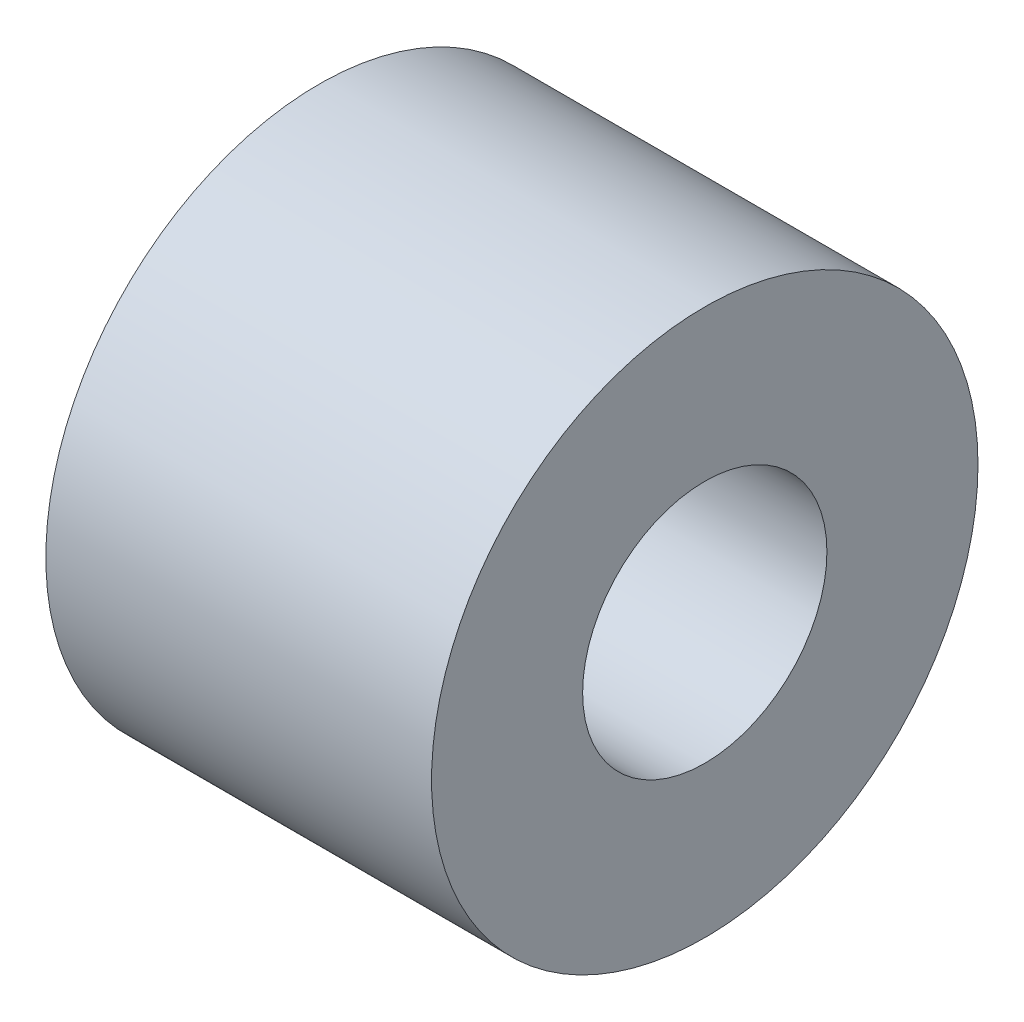
ISO-10303-21;
HEADER;
FILE_DESCRIPTION(('STEP AP214'),'2;1');
FILE_NAME('part.step','',(''),(''),'','','');
FILE_SCHEMA(('AUTOMOTIVE_DESIGN { 1 0 10303 214 1 1 1 1 }'));
ENDSEC;
DATA;
#1=APPLICATION_CONTEXT('core data for automotive mechanical design processes');
#2=APPLICATION_PROTOCOL_DEFINITION('international standard','automotive_design',2000,#1);
#3=PRODUCT_CONTEXT('',#1,'mechanical');
#4=PRODUCT('Part','Part','',(#3));
#5=PRODUCT_RELATED_PRODUCT_CATEGORY('part','',(#4));
#6=PRODUCT_DEFINITION_FORMATION('','',#4);
#7=PRODUCT_DEFINITION_CONTEXT('part definition',#1,'design');
#8=PRODUCT_DEFINITION('design','',#6,#7);
#9=PRODUCT_DEFINITION_SHAPE('','',#8);
#10=(LENGTH_UNIT() NAMED_UNIT(*) SI_UNIT(.MILLI.,.METRE.));
#11=(NAMED_UNIT(*) PLANE_ANGLE_UNIT() SI_UNIT($,.RADIAN.));
#12=(NAMED_UNIT(*) SI_UNIT($,.STERADIAN.) SOLID_ANGLE_UNIT());
#13=UNCERTAINTY_MEASURE_WITH_UNIT(LENGTH_MEASURE(1.E-05),#10,'distance_accuracy_value','');
#14=(GEOMETRIC_REPRESENTATION_CONTEXT(3) GLOBAL_UNCERTAINTY_ASSIGNED_CONTEXT((#13)) GLOBAL_UNIT_ASSIGNED_CONTEXT((#10,
#11,#12)) REPRESENTATION_CONTEXT('',''));
#15=CARTESIAN_POINT('',(0.,0.,0.));
#16=DIRECTION('',(0.,0.,1.));
#17=DIRECTION('',(1.,0.,0.));
#18=AXIS2_PLACEMENT_3D('',#15,#16,#17);
#19=CARTESIAN_POINT('',(-7.62,0.,0.));
#20=DIRECTION('',(1.,0.,0.));
#21=DIRECTION('',(0.,0.,-1.));
#22=AXIS2_PLACEMENT_3D('',#19,#20,#21);
#23=CYLINDRICAL_SURFACE('',#22,5.3975);
#24=CARTESIAN_POINT('',(-7.62,0.,0.));
#25=DIRECTION('',(1.,0.,0.));
#26=DIRECTION('',(0.,0.,-1.));
#27=AXIS2_PLACEMENT_3D('',#24,#25,#26);
#28=CIRCLE('',#27,5.3975);
#29=CARTESIAN_POINT('',(-7.62,0.,-5.3975));
#30=VERTEX_POINT('',#29);
#31=EDGE_CURVE('E10',#30,#30,#28,.T.);
#32=CARTESIAN_POINT('',(0.,0.,0.));
#33=DIRECTION('',(1.,0.,0.));
#34=DIRECTION('',(0.,0.,-1.));
#35=AXIS2_PLACEMENT_3D('',#32,#33,#34);
#36=CIRCLE('',#35,5.3975);
#37=CARTESIAN_POINT('',(0.,0.,-5.3975));
#38=VERTEX_POINT('',#37);
#39=EDGE_CURVE('E40',#38,#38,#36,.T.);
#40=CARTESIAN_POINT('',(-7.62,0.,-5.3975));
#41=CARTESIAN_POINT('',(-7.540625,0.,-5.3975));
#42=CARTESIAN_POINT('',(-7.46125,0.,-5.3975));
#43=CARTESIAN_POINT('',(-7.3025,0.,-5.3975));
#44=CARTESIAN_POINT('',(-7.223125,0.,-5.3975));
#45=CARTESIAN_POINT('',(-7.064375,0.,-5.3975));
#46=CARTESIAN_POINT('',(-6.985,0.,-5.3975));
#47=CARTESIAN_POINT('',(-6.82625,0.,-5.3975));
#48=CARTESIAN_POINT('',(-6.746875,0.,-5.3975));
#49=CARTESIAN_POINT('',(-6.588125,0.,-5.3975));
#50=CARTESIAN_POINT('',(-6.50875,0.,-5.3975));
#51=CARTESIAN_POINT('',(-6.35,0.,-5.3975));
#52=CARTESIAN_POINT('',(-6.270625,0.,-5.3975));
#53=CARTESIAN_POINT('',(-6.111875,0.,-5.3975));
#54=CARTESIAN_POINT('',(-6.0325,0.,-5.3975));
#55=CARTESIAN_POINT('',(-5.87375,0.,-5.3975));
#56=CARTESIAN_POINT('',(-5.794375,0.,-5.3975));
#57=CARTESIAN_POINT('',(-5.635625,0.,-5.3975));
#58=CARTESIAN_POINT('',(-5.55625,0.,-5.3975));
#59=CARTESIAN_POINT('',(-5.3975,0.,-5.3975));
#60=CARTESIAN_POINT('',(-5.318125,0.,-5.3975));
#61=CARTESIAN_POINT('',(-5.159375,0.,-5.3975));
#62=CARTESIAN_POINT('',(-5.08,0.,-5.3975));
#63=CARTESIAN_POINT('',(-4.92125,0.,-5.3975));
#64=CARTESIAN_POINT('',(-4.841875,0.,-5.3975));
#65=CARTESIAN_POINT('',(-4.683125,0.,-5.3975));
#66=CARTESIAN_POINT('',(-4.60375,0.,-5.3975));
#67=CARTESIAN_POINT('',(-4.445,0.,-5.3975));
#68=CARTESIAN_POINT('',(-4.365625,0.,-5.3975));
#69=CARTESIAN_POINT('',(-4.206875,0.,-5.3975));
#70=CARTESIAN_POINT('',(-4.1275,0.,-5.3975));
#71=CARTESIAN_POINT('',(-3.96875,0.,-5.3975));
#72=CARTESIAN_POINT('',(-3.889375,0.,-5.3975));
#73=CARTESIAN_POINT('',(-3.730625,0.,-5.3975));
#74=CARTESIAN_POINT('',(-3.65125,0.,-5.3975));
#75=CARTESIAN_POINT('',(-3.4925,0.,-5.3975));
#76=CARTESIAN_POINT('',(-3.413125,0.,-5.3975));
#77=CARTESIAN_POINT('',(-3.254375,0.,-5.3975));
#78=CARTESIAN_POINT('',(-3.175,0.,-5.3975));
#79=CARTESIAN_POINT('',(-3.01625,0.,-5.3975));
#80=CARTESIAN_POINT('',(-2.936875,0.,-5.3975));
#81=CARTESIAN_POINT('',(-2.778125,0.,-5.3975));
#82=CARTESIAN_POINT('',(-2.69875,0.,-5.3975));
#83=CARTESIAN_POINT('',(-2.54,0.,-5.3975));
#84=CARTESIAN_POINT('',(-2.460625,0.,-5.3975));
#85=CARTESIAN_POINT('',(-2.301875,0.,-5.3975));
#86=CARTESIAN_POINT('',(-2.2225,0.,-5.3975));
#87=CARTESIAN_POINT('',(-2.06375,0.,-5.3975));
#88=CARTESIAN_POINT('',(-1.984375,0.,-5.3975));
#89=CARTESIAN_POINT('',(-1.825625,0.,-5.3975));
#90=CARTESIAN_POINT('',(-1.74625,0.,-5.3975));
#91=CARTESIAN_POINT('',(-1.5875,0.,-5.3975));
#92=CARTESIAN_POINT('',(-1.508125,0.,-5.3975));
#93=CARTESIAN_POINT('',(-1.349375,0.,-5.3975));
#94=CARTESIAN_POINT('',(-1.27,0.,-5.3975));
#95=CARTESIAN_POINT('',(-1.11125,0.,-5.3975));
#96=CARTESIAN_POINT('',(-1.031875,0.,-5.3975));
#97=CARTESIAN_POINT('',(-0.873125,0.,-5.3975));
#98=CARTESIAN_POINT('',(-0.79375,0.,-5.3975));
#99=CARTESIAN_POINT('',(-0.635,0.,-5.3975));
#100=CARTESIAN_POINT('',(-0.555625,0.,-5.3975));
#101=CARTESIAN_POINT('',(-0.396875,0.,-5.3975));
#102=CARTESIAN_POINT('',(-0.3175,0.,-5.3975));
#103=CARTESIAN_POINT('',(-0.15875,0.,-5.3975));
#104=CARTESIAN_POINT('',(-0.0793749999999999,0.,-5.3975));
#105=CARTESIAN_POINT('',(0.,0.,-5.3975));
#106=B_SPLINE_CURVE_WITH_KNOTS('',3,(#40,#41,#42,#43,#44,#45,#46,#47,#48,#49,#50,#51,#52,#53,
#54,#55,#56,#57,#58,#59,#60,#61,#62,#63,#64,#65,#66,#67,#68,#69,#70,#71,#72,#73,#74,#75,#76,#77,
#78,#79,#80,#81,#82,#83,#84,#85,#86,#87,#88,#89,#90,#91,#92,#93,#94,#95,#96,#97,#98,#99,#100,
#101,#102,#103,#104,#105),.UNSPECIFIED.,.F.,.F.,(4,2,2,2,2,2,2,2,2,2,2,2,2,2,2,2,2,2,2,2,2,2,2,
2,2,2,2,2,2,2,2,2,4),(0.,0.238125,0.47625,0.714375000000001,0.9525,1.190625,1.42875,1.666875,
1.905,2.143125,2.38125,2.619375,2.8575,3.095625,3.33375,3.571875,3.81,4.048125,4.28625,4.524375,
4.7625,5.000625,5.23875,5.476875,5.715,5.953125,6.19125,6.429375,6.6675,6.905625,7.14375,
7.381875,7.62),.UNSPECIFIED.);
#107=EDGE_CURVE('BSEAM37',#30,#38,#106,.T.);
#108=ORIENTED_EDGE('',*,*,#31,.T.);
#109=ORIENTED_EDGE('',*,*,#39,.F.);
#110=ORIENTED_EDGE('',*,*,#107,.T.);
#111=ORIENTED_EDGE('',*,*,#107,.F.);
#112=EDGE_LOOP('',(#108,#110,#109,#111));
#113=FACE_BOUND('',#112,.T.);
#114=ADVANCED_FACE('F37',(#113),#23,.T.);
#115=CARTESIAN_POINT('',(-7.62,0.,0.));
#116=DIRECTION('',(1.,0.,0.));
#117=DIRECTION('',(0.,0.,-1.));
#118=AXIS2_PLACEMENT_3D('',#115,#116,#117);
#119=PLANE('',#118);
#120=CARTESIAN_POINT('',(-7.62,0.,0.));
#121=DIRECTION('',(1.,0.,0.));
#122=DIRECTION('',(0.,0.,-1.));
#123=AXIS2_PLACEMENT_3D('',#120,#121,#122);
#124=CIRCLE('',#123,2.413);
#125=CARTESIAN_POINT('',(-7.62,0.,-2.413));
#126=VERTEX_POINT('',#125);
#127=EDGE_CURVE('E47',#126,#126,#124,.T.);
#128=ORIENTED_EDGE('',*,*,#127,.T.);
#129=EDGE_LOOP('',(#128));
#130=FACE_BOUND('',#129,.T.);
#131=ORIENTED_EDGE('',*,*,#31,.F.);
#132=EDGE_LOOP('',(#131));
#133=FACE_BOUND('',#132,.T.);
#134=ADVANCED_FACE('F55',(#130,#133),#119,.F.);
#135=CARTESIAN_POINT('',(0.,0.,0.));
#136=DIRECTION('',(1.,0.,0.));
#137=DIRECTION('',(0.,0.,-1.));
#138=AXIS2_PLACEMENT_3D('',#135,#136,#137);
#139=PLANE('',#138);
#140=CARTESIAN_POINT('',(0.,0.,0.));
#141=DIRECTION('',(1.,0.,0.));
#142=DIRECTION('',(0.,0.,-1.));
#143=AXIS2_PLACEMENT_3D('',#140,#141,#142);
#144=CIRCLE('',#143,2.413);
#145=CARTESIAN_POINT('',(0.,0.,-2.413));
#146=VERTEX_POINT('',#145);
#147=EDGE_CURVE('E49',#146,#146,#144,.T.);
#148=ORIENTED_EDGE('',*,*,#147,.F.);
#149=EDGE_LOOP('',(#148));
#150=FACE_BOUND('',#149,.T.);
#151=ORIENTED_EDGE('',*,*,#39,.T.);
#152=EDGE_LOOP('',(#151));
#153=FACE_BOUND('',#152,.T.);
#154=ADVANCED_FACE('F61',(#150,#153),#139,.T.);
#155=CARTESIAN_POINT('',(-7.62,0.,0.));
#156=DIRECTION('',(1.,0.,0.));
#157=DIRECTION('',(0.,0.,-1.));
#158=AXIS2_PLACEMENT_3D('',#155,#156,#157);
#159=CYLINDRICAL_SURFACE('',#158,2.413);
#160=CARTESIAN_POINT('',(-7.62,0.,-2.413));
#161=CARTESIAN_POINT('',(-7.540625,0.,-2.413));
#162=CARTESIAN_POINT('',(-7.46125,0.,-2.413));
#163=CARTESIAN_POINT('',(-7.3025,0.,-2.413));
#164=CARTESIAN_POINT('',(-7.223125,0.,-2.413));
#165=CARTESIAN_POINT('',(-7.064375,0.,-2.413));
#166=CARTESIAN_POINT('',(-6.985,0.,-2.413));
#167=CARTESIAN_POINT('',(-6.82625,0.,-2.413));
#168=CARTESIAN_POINT('',(-6.746875,0.,-2.413));
#169=CARTESIAN_POINT('',(-6.588125,0.,-2.413));
#170=CARTESIAN_POINT('',(-6.50875,0.,-2.413));
#171=CARTESIAN_POINT('',(-6.35,0.,-2.413));
#172=CARTESIAN_POINT('',(-6.270625,0.,-2.413));
#173=CARTESIAN_POINT('',(-6.111875,0.,-2.413));
#174=CARTESIAN_POINT('',(-6.0325,0.,-2.413));
#175=CARTESIAN_POINT('',(-5.87375,0.,-2.413));
#176=CARTESIAN_POINT('',(-5.794375,0.,-2.413));
#177=CARTESIAN_POINT('',(-5.635625,0.,-2.413));
#178=CARTESIAN_POINT('',(-5.55625,0.,-2.413));
#179=CARTESIAN_POINT('',(-5.3975,0.,-2.413));
#180=CARTESIAN_POINT('',(-5.318125,0.,-2.413));
#181=CARTESIAN_POINT('',(-5.159375,0.,-2.413));
#182=CARTESIAN_POINT('',(-5.08,0.,-2.413));
#183=CARTESIAN_POINT('',(-4.92125,0.,-2.413));
#184=CARTESIAN_POINT('',(-4.841875,0.,-2.413));
#185=CARTESIAN_POINT('',(-4.683125,0.,-2.413));
#186=CARTESIAN_POINT('',(-4.60375,0.,-2.413));
#187=CARTESIAN_POINT('',(-4.445,0.,-2.413));
#188=CARTESIAN_POINT('',(-4.365625,0.,-2.413));
#189=CARTESIAN_POINT('',(-4.206875,0.,-2.413));
#190=CARTESIAN_POINT('',(-4.1275,0.,-2.413));
#191=CARTESIAN_POINT('',(-3.96875,0.,-2.413));
#192=CARTESIAN_POINT('',(-3.889375,0.,-2.413));
#193=CARTESIAN_POINT('',(-3.730625,0.,-2.413));
#194=CARTESIAN_POINT('',(-3.65125,0.,-2.413));
#195=CARTESIAN_POINT('',(-3.4925,0.,-2.413));
#196=CARTESIAN_POINT('',(-3.413125,0.,-2.413));
#197=CARTESIAN_POINT('',(-3.254375,0.,-2.413));
#198=CARTESIAN_POINT('',(-3.175,0.,-2.413));
#199=CARTESIAN_POINT('',(-3.01625,0.,-2.413));
#200=CARTESIAN_POINT('',(-2.936875,0.,-2.413));
#201=CARTESIAN_POINT('',(-2.778125,0.,-2.413));
#202=CARTESIAN_POINT('',(-2.69875,0.,-2.413));
#203=CARTESIAN_POINT('',(-2.54,0.,-2.413));
#204=CARTESIAN_POINT('',(-2.460625,0.,-2.413));
#205=CARTESIAN_POINT('',(-2.301875,0.,-2.413));
#206=CARTESIAN_POINT('',(-2.2225,0.,-2.413));
#207=CARTESIAN_POINT('',(-2.06375,0.,-2.413));
#208=CARTESIAN_POINT('',(-1.984375,0.,-2.413));
#209=CARTESIAN_POINT('',(-1.825625,0.,-2.413));
#210=CARTESIAN_POINT('',(-1.74625,0.,-2.413));
#211=CARTESIAN_POINT('',(-1.5875,0.,-2.413));
#212=CARTESIAN_POINT('',(-1.508125,0.,-2.413));
#213=CARTESIAN_POINT('',(-1.349375,0.,-2.413));
#214=CARTESIAN_POINT('',(-1.27,0.,-2.413));
#215=CARTESIAN_POINT('',(-1.11125,0.,-2.413));
#216=CARTESIAN_POINT('',(-1.031875,0.,-2.413));
#217=CARTESIAN_POINT('',(-0.873125,0.,-2.413));
#218=CARTESIAN_POINT('',(-0.79375,0.,-2.413));
#219=CARTESIAN_POINT('',(-0.635,0.,-2.413));
#220=CARTESIAN_POINT('',(-0.555625,0.,-2.413));
#221=CARTESIAN_POINT('',(-0.396875,0.,-2.413));
#222=CARTESIAN_POINT('',(-0.3175,0.,-2.413));
#223=CARTESIAN_POINT('',(-0.15875,0.,-2.413));
#224=CARTESIAN_POINT('',(-0.0793749999999999,0.,-2.413));
#225=CARTESIAN_POINT('',(0.,0.,-2.413));
#226=B_SPLINE_CURVE_WITH_KNOTS('',3,(#160,#161,#162,#163,#164,#165,#166,#167,#168,#169,#170,
#171,#172,#173,#174,#175,#176,#177,#178,#179,#180,#181,#182,#183,#184,#185,#186,#187,#188,#189,
#190,#191,#192,#193,#194,#195,#196,#197,#198,#199,#200,#201,#202,#203,#204,#205,#206,#207,#208,
#209,#210,#211,#212,#213,#214,#215,#216,#217,#218,#219,#220,#221,#222,#223,#224,#225),
.UNSPECIFIED.,.F.,.F.,(4,2,2,2,2,2,2,2,2,2,2,2,2,2,2,2,2,2,2,2,2,2,2,2,2,2,2,2,2,2,2,2,4),(0.,
0.238125,0.47625,0.714375000000001,0.9525,1.190625,1.42875,1.666875,1.905,2.143125,2.38125,
2.619375,2.8575,3.095625,3.33375,3.571875,3.81,4.048125,4.28625,4.524375,4.7625,5.000625,
5.23875,5.476875,5.715,5.953125,6.19125,6.429375,6.6675,6.905625,7.14375,7.381875,7.62),.UNSPECIFIED.);
#227=EDGE_CURVE('BSEAM58',#126,#146,#226,.T.);
#228=ORIENTED_EDGE('',*,*,#127,.F.);
#229=ORIENTED_EDGE('',*,*,#147,.T.);
#230=ORIENTED_EDGE('',*,*,#227,.T.);
#231=ORIENTED_EDGE('',*,*,#227,.F.);
#232=EDGE_LOOP('',(#228,#230,#229,#231));
#233=FACE_BOUND('',#232,.T.);
#234=ADVANCED_FACE('F58',(#233),#159,.F.);
#235=CLOSED_SHELL('',(#114,#134,#154,#234));
#236=MANIFOLD_SOLID_BREP('B2',#235);
#237=ADVANCED_BREP_SHAPE_REPRESENTATION('',(#18,#236),#14);
#238=SHAPE_DEFINITION_REPRESENTATION(#9,#237);
ENDSEC;
END-ISO-10303-21;
